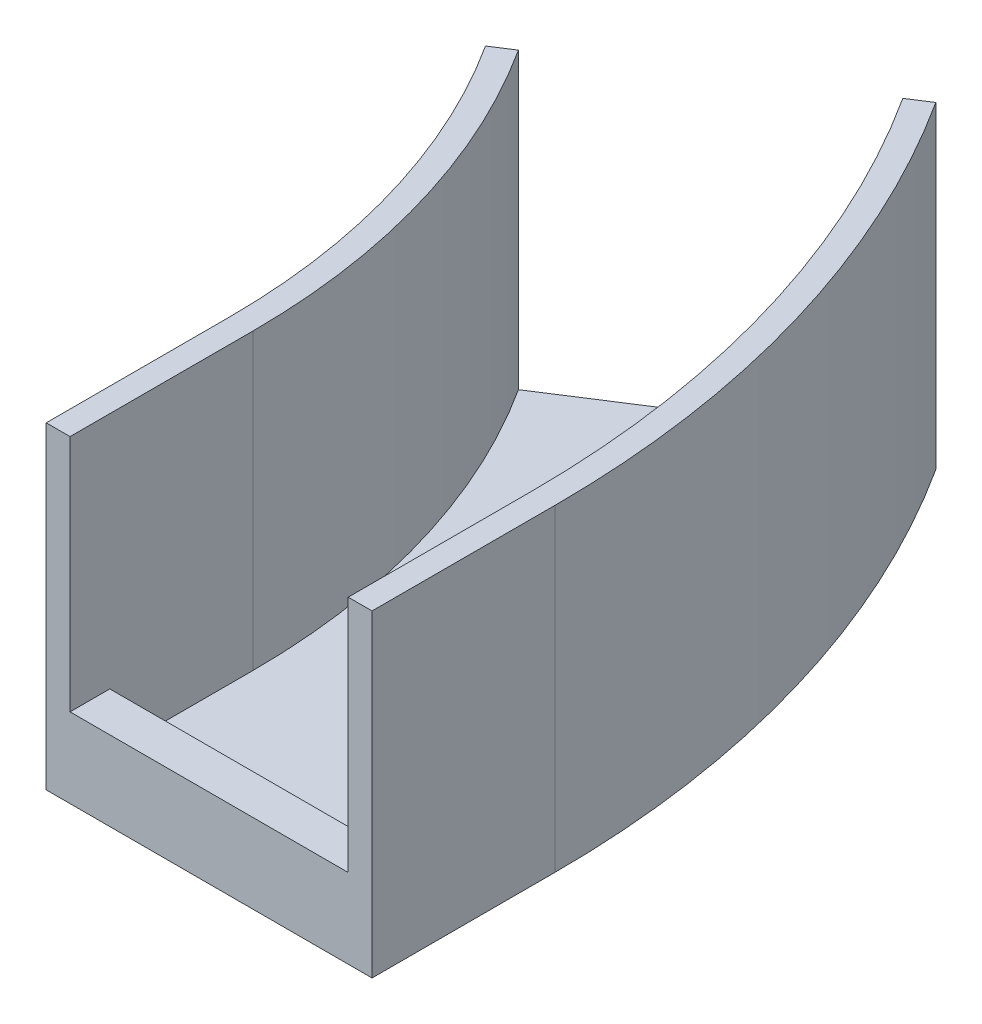
ISO-10303-21;
HEADER;
FILE_DESCRIPTION(('STEP AP214'),'2;1');
FILE_NAME('part.step','',(''),(''),'','','');
FILE_SCHEMA(('AUTOMOTIVE_DESIGN { 1 0 10303 214 1 1 1 1 }'));
ENDSEC;
DATA;
#1=APPLICATION_CONTEXT('core data for automotive mechanical design processes');
#2=APPLICATION_PROTOCOL_DEFINITION('international standard','automotive_design',2000,#1);
#3=PRODUCT_CONTEXT('',#1,'mechanical');
#4=PRODUCT('Part','Part','',(#3));
#5=PRODUCT_RELATED_PRODUCT_CATEGORY('part','',(#4));
#6=PRODUCT_DEFINITION_FORMATION('','',#4);
#7=PRODUCT_DEFINITION_CONTEXT('part definition',#1,'design');
#8=PRODUCT_DEFINITION('design','',#6,#7);
#9=PRODUCT_DEFINITION_SHAPE('','',#8);
#10=(LENGTH_UNIT() NAMED_UNIT(*) SI_UNIT(.MILLI.,.METRE.));
#11=(NAMED_UNIT(*) PLANE_ANGLE_UNIT() SI_UNIT($,.RADIAN.));
#12=(NAMED_UNIT(*) SI_UNIT($,.STERADIAN.) SOLID_ANGLE_UNIT());
#13=UNCERTAINTY_MEASURE_WITH_UNIT(LENGTH_MEASURE(1.E-05),#10,'distance_accuracy_value','');
#14=(GEOMETRIC_REPRESENTATION_CONTEXT(3) GLOBAL_UNCERTAINTY_ASSIGNED_CONTEXT((#13)) GLOBAL_UNIT_ASSIGNED_CONTEXT((#10,
#11,#12)) REPRESENTATION_CONTEXT('',''));
#15=CARTESIAN_POINT('',(0.,0.,0.));
#16=DIRECTION('',(0.,0.,1.));
#17=DIRECTION('',(1.,0.,0.));
#18=AXIS2_PLACEMENT_3D('',#15,#16,#17);
#19=CARTESIAN_POINT('',(0.,40.,0.));
#20=DIRECTION('',(0.,-1.,0.));
#21=DIRECTION('',(0.,0.,-1.));
#22=AXIS2_PLACEMENT_3D('',#19,#20,#21);
#23=CYLINDRICAL_SURFACE('',#22,87.5);
#24=CARTESIAN_POINT('',(0.,3.,0.));
#25=DIRECTION('',(0.,-1.,0.));
#26=DIRECTION('',(0.,0.,-1.));
#27=AXIS2_PLACEMENT_3D('',#24,#25,#26);
#28=CIRCLE('',#27,87.5);
#29=CARTESIAN_POINT('',(73.5991740759714,3.,-47.3224214863828));
#30=VERTEX_POINT('',#29);
#31=CARTESIAN_POINT('',(87.5,3.,0.));
#32=VERTEX_POINT('',#31);
#33=EDGE_CURVE('E56',#30,#32,#28,.T.);
#34=ORIENTED_EDGE('',*,*,#33,.F.);
#35=DIRECTION('',(0.,-1.,0.));
#36=VECTOR('',#35,1.);
#37=CARTESIAN_POINT('',(73.5991740759714,40.,-47.3224214863828));
#38=LINE('',#37,#36);
#39=CARTESIAN_POINT('',(73.5991740759714,40.,-47.3224214863828));
#40=VERTEX_POINT('',#39);
#41=EDGE_CURVE('E49',#40,#30,#38,.T.);
#42=ORIENTED_EDGE('',*,*,#41,.F.);
#43=CARTESIAN_POINT('',(0.,40.,0.));
#44=DIRECTION('',(0.,1.,0.));
#45=DIRECTION('',(0.,0.,1.));
#46=AXIS2_PLACEMENT_3D('',#43,#44,#45);
#47=CIRCLE('',#46,87.5);
#48=CARTESIAN_POINT('',(87.5,40.,0.));
#49=VERTEX_POINT('',#48);
#50=EDGE_CURVE('E157',#49,#40,#47,.T.);
#51=ORIENTED_EDGE('',*,*,#50,.F.);
#52=DIRECTION('',(0.,-1.,0.));
#53=VECTOR('',#52,1.);
#54=CARTESIAN_POINT('',(87.5,40.,0.));
#55=LINE('',#54,#53);
#56=EDGE_CURVE('E241',#49,#32,#55,.T.);
#57=ORIENTED_EDGE('',*,*,#56,.T.);
#58=EDGE_LOOP('',(#34,#42,#51,#57));
#59=FACE_BOUND('',#58,.T.);
#60=ADVANCED_FACE('F41',(#59),#23,.T.);
#61=CARTESIAN_POINT('',(87.5,40.,0.));
#62=DIRECTION('',(1.,0.,0.));
#63=DIRECTION('',(0.,0.,-1.));
#64=AXIS2_PLACEMENT_3D('',#61,#62,#63);
#65=PLANE('',#64);
#66=DIRECTION('',(0.,1.,0.));
#67=VECTOR('',#66,1.);
#68=CARTESIAN_POINT('',(87.5,40.,18.));
#69=LINE('',#68,#67);
#70=CARTESIAN_POINT('',(87.5,3.,18.));
#71=VERTEX_POINT('',#70);
#72=CARTESIAN_POINT('',(87.5,10.,18.));
#73=VERTEX_POINT('',#72);
#74=EDGE_CURVE('E217',#71,#73,#69,.T.);
#75=ORIENTED_EDGE('',*,*,#74,.F.);
#76=DIRECTION('',(0.,0.,1.));
#77=VECTOR('',#76,1.);
#78=CARTESIAN_POINT('',(87.5,3.,0.));
#79=LINE('',#78,#77);
#80=EDGE_CURVE('E64',#32,#71,#79,.T.);
#81=ORIENTED_EDGE('',*,*,#80,.F.);
#82=ORIENTED_EDGE('',*,*,#56,.F.);
#83=DIRECTION('',(0.,0.,1.));
#84=VECTOR('',#83,1.);
#85=CARTESIAN_POINT('',(87.5,40.,20.));
#86=LINE('',#85,#84);
#87=CARTESIAN_POINT('',(87.5,40.,23.));
#88=VERTEX_POINT('',#87);
#89=EDGE_CURVE('E237',#49,#88,#86,.T.);
#90=ORIENTED_EDGE('',*,*,#89,.T.);
#91=DIRECTION('',(0.,-1.,0.));
#92=VECTOR('',#91,1.);
#93=CARTESIAN_POINT('',(87.5,40.,23.));
#94=LINE('',#93,#92);
#95=CARTESIAN_POINT('',(87.5,10.,23.));
#96=VERTEX_POINT('',#95);
#97=EDGE_CURVE('E252',#88,#96,#94,.T.);
#98=ORIENTED_EDGE('',*,*,#97,.T.);
#99=DIRECTION('',(0.,0.,1.));
#100=VECTOR('',#99,1.);
#101=CARTESIAN_POINT('',(87.5,10.,0.));
#102=LINE('',#101,#100);
#103=EDGE_CURVE('E11',#73,#96,#102,.T.);
#104=ORIENTED_EDGE('',*,*,#103,.F.);
#105=EDGE_LOOP('',(#75,#81,#82,#90,#98,#104));
#106=FACE_BOUND('',#105,.T.);
#107=ADVANCED_FACE('F316',(#106),#65,.T.);
#108=CARTESIAN_POINT('',(87.4825495110081,10.,18.));
#109=DIRECTION('',(0.,0.,-1.));
#110=DIRECTION('',(-1.,0.,0.));
#111=AXIS2_PLACEMENT_3D('',#108,#109,#110);
#112=PLANE('',#111);
#113=DIRECTION('',(0.,-1.,0.));
#114=VECTOR('',#113,1.);
#115=CARTESIAN_POINT('',(122.5,10.,18.));
#116=LINE('',#115,#114);
#117=CARTESIAN_POINT('',(122.5,10.,18.));
#118=VERTEX_POINT('',#117);
#119=CARTESIAN_POINT('',(122.5,3.,18.));
#120=VERTEX_POINT('',#119);
#121=EDGE_CURVE('E213',#118,#120,#116,.T.);
#122=ORIENTED_EDGE('',*,*,#121,.T.);
#123=DIRECTION('',(1.,0.,0.));
#124=VECTOR('',#123,1.);
#125=CARTESIAN_POINT('',(0.,3.,18.));
#126=LINE('',#125,#124);
#127=EDGE_CURVE('E288',#71,#120,#126,.T.);
#128=ORIENTED_EDGE('',*,*,#127,.F.);
#129=ORIENTED_EDGE('',*,*,#74,.T.);
#130=DIRECTION('',(1.,0.,0.));
#131=VECTOR('',#130,1.);
#132=CARTESIAN_POINT('',(87.4825495110081,10.,18.));
#133=LINE('',#132,#131);
#134=EDGE_CURVE('E180',#73,#118,#133,.T.);
#135=ORIENTED_EDGE('',*,*,#134,.T.);
#136=EDGE_LOOP('',(#122,#128,#129,#135));
#137=FACE_BOUND('',#136,.T.);
#138=ADVANCED_FACE('F313',(#137),#112,.T.);
#139=CARTESIAN_POINT('',(0.,40.,0.));
#140=DIRECTION('',(0.,-1.,0.));
#141=DIRECTION('',(0.,0.,-1.));
#142=AXIS2_PLACEMENT_3D('',#139,#140,#141);
#143=CYLINDRICAL_SURFACE('',#142,122.5);
#144=DIRECTION('',(0.,-1.,0.));
#145=VECTOR('',#144,1.);
#146=CARTESIAN_POINT('',(103.03884370636,40.,-66.2513900809359));
#147=LINE('',#146,#145);
#148=CARTESIAN_POINT('',(103.03884370636,40.,-66.2513900809359));
#149=VERTEX_POINT('',#148);
#150=CARTESIAN_POINT('',(103.03884370636,3.,-66.2513900809359));
#151=VERTEX_POINT('',#150);
#152=EDGE_CURVE('E193',#149,#151,#147,.T.);
#153=ORIENTED_EDGE('',*,*,#152,.T.);
#154=CARTESIAN_POINT('',(0.,3.,0.));
#155=DIRECTION('',(0.,-1.,0.));
#156=DIRECTION('',(0.,0.,-1.));
#157=AXIS2_PLACEMENT_3D('',#154,#155,#156);
#158=CIRCLE('',#157,122.5);
#159=CARTESIAN_POINT('',(122.5,3.,0.));
#160=VERTEX_POINT('',#159);
#161=EDGE_CURVE('E277',#160,#151,#158,.F.);
#162=ORIENTED_EDGE('',*,*,#161,.F.);
#163=DIRECTION('',(0.,-1.,0.));
#164=VECTOR('',#163,1.);
#165=CARTESIAN_POINT('',(122.5,40.,0.));
#166=LINE('',#165,#164);
#167=CARTESIAN_POINT('',(122.5,40.,0.));
#168=VERTEX_POINT('',#167);
#169=EDGE_CURVE('E186',#168,#160,#166,.T.);
#170=ORIENTED_EDGE('',*,*,#169,.F.);
#171=CARTESIAN_POINT('',(0.,40.,0.));
#172=DIRECTION('',(0.,1.,0.));
#173=DIRECTION('',(0.,0.,1.));
#174=AXIS2_PLACEMENT_3D('',#171,#172,#173);
#175=CIRCLE('',#174,122.5);
#176=EDGE_CURVE('E176',#168,#149,#175,.T.);
#177=ORIENTED_EDGE('',*,*,#176,.T.);
#178=EDGE_LOOP('',(#153,#162,#170,#177));
#179=FACE_BOUND('',#178,.T.);
#180=ADVANCED_FACE('F337',(#179),#143,.F.);
#181=CARTESIAN_POINT('',(122.5,40.,0.));
#182=DIRECTION('',(1.,0.,0.));
#183=DIRECTION('',(0.,0.,-1.));
#184=AXIS2_PLACEMENT_3D('',#181,#182,#183);
#185=PLANE('',#184);
#186=DIRECTION('',(0.,0.,-1.));
#187=VECTOR('',#186,1.);
#188=CARTESIAN_POINT('',(122.5,3.,0.));
#189=LINE('',#188,#187);
#190=EDGE_CURVE('E282',#120,#160,#189,.T.);
#191=ORIENTED_EDGE('',*,*,#190,.F.);
#192=ORIENTED_EDGE('',*,*,#121,.F.);
#193=DIRECTION('',(0.,0.,1.));
#194=VECTOR('',#193,1.);
#195=CARTESIAN_POINT('',(122.5,10.,23.));
#196=LINE('',#195,#194);
#197=CARTESIAN_POINT('',(122.5,10.,23.));
#198=VERTEX_POINT('',#197);
#199=EDGE_CURVE('E205',#118,#198,#196,.T.);
#200=ORIENTED_EDGE('',*,*,#199,.T.);
#201=DIRECTION('',(0.,-1.,0.));
#202=VECTOR('',#201,1.);
#203=CARTESIAN_POINT('',(122.5,40.,23.));
#204=LINE('',#203,#202);
#205=CARTESIAN_POINT('',(122.5,40.,23.));
#206=VERTEX_POINT('',#205);
#207=EDGE_CURVE('E169',#206,#198,#204,.T.);
#208=ORIENTED_EDGE('',*,*,#207,.F.);
#209=DIRECTION('',(0.,0.,1.));
#210=VECTOR('',#209,1.);
#211=CARTESIAN_POINT('',(122.5,40.,20.));
#212=LINE('',#211,#210);
#213=EDGE_CURVE('E189',#168,#206,#212,.T.);
#214=ORIENTED_EDGE('',*,*,#213,.F.);
#215=ORIENTED_EDGE('',*,*,#169,.T.);
#216=EDGE_LOOP('',(#191,#192,#200,#208,#214,#215));
#217=FACE_BOUND('',#216,.T.);
#218=ADVANCED_FACE('F308',(#217),#185,.F.);
#219=CARTESIAN_POINT('',(71.0757738219381,40.,-45.6999384639925));
#220=DIRECTION('',(-0.540827674130088,0.,-0.841133418011102));
#221=DIRECTION('',(-0.841133418011102,0.,0.540827674130088));
#222=AXIS2_PLACEMENT_3D('',#219,#220,#221);
#223=PLANE('',#222);
#224=DIRECTION('',(0.841133418011102,0.,-0.540827674130088));
#225=VECTOR('',#224,1.);
#226=CARTESIAN_POINT('',(71.0757738219381,0.,-45.6999384639925));
#227=LINE('',#226,#225);
#228=CARTESIAN_POINT('',(71.0757738219381,0.,-45.6999384639925));
#229=VERTEX_POINT('',#228);
#230=CARTESIAN_POINT('',(105.562243960393,0.,-67.8738731033262));
#231=VERTEX_POINT('',#230);
#232=EDGE_CURVE('E220',#229,#231,#227,.T.);
#233=ORIENTED_EDGE('',*,*,#232,.F.);
#234=DIRECTION('',(0.,-1.,0.));
#235=VECTOR('',#234,1.);
#236=CARTESIAN_POINT('',(71.0757738219381,40.,-45.6999384639925));
#237=LINE('',#236,#235);
#238=CARTESIAN_POINT('',(71.0757738219381,40.,-45.6999384639925));
#239=VERTEX_POINT('',#238);
#240=EDGE_CURVE('E261',#239,#229,#237,.T.);
#241=ORIENTED_EDGE('',*,*,#240,.F.);
#242=DIRECTION('',(0.841133418011102,0.,-0.540827674130088));
#243=VECTOR('',#242,1.);
#244=CARTESIAN_POINT('',(71.0757738219381,40.,-45.6999384639925));
#245=LINE('',#244,#243);
#246=EDGE_CURVE('E223',#239,#40,#245,.T.);
#247=ORIENTED_EDGE('',*,*,#246,.T.);
#248=ORIENTED_EDGE('',*,*,#41,.T.);
#249=DIRECTION('',(0.841133418011102,0.,-0.540827674130089));
#250=VECTOR('',#249,1.);
#251=CARTESIAN_POINT('',(0.,3.,0.));
#252=LINE('',#251,#250);
#253=EDGE_CURVE('E270',#30,#151,#252,.T.);
#254=ORIENTED_EDGE('',*,*,#253,.T.);
#255=ORIENTED_EDGE('',*,*,#152,.F.);
#256=DIRECTION('',(-0.841133418011102,0.,0.540827674130088));
#257=VECTOR('',#256,1.);
#258=CARTESIAN_POINT('',(105.562243960393,40.,-67.8738731033262));
#259=LINE('',#258,#257);
#260=CARTESIAN_POINT('',(105.562243960393,40.,-67.8738731033262));
#261=VERTEX_POINT('',#260);
#262=EDGE_CURVE('E183',#261,#149,#259,.T.);
#263=ORIENTED_EDGE('',*,*,#262,.F.);
#264=DIRECTION('',(0.,-1.,0.));
#265=VECTOR('',#264,1.);
#266=CARTESIAN_POINT('',(105.562243960393,40.,-67.8738731033262));
#267=LINE('',#266,#265);
#268=EDGE_CURVE('E296',#261,#231,#267,.T.);
#269=ORIENTED_EDGE('',*,*,#268,.T.);
#270=EDGE_LOOP('',(#233,#241,#247,#248,#254,#255,#263,#269));
#271=FACE_BOUND('',#270,.T.);
#272=ADVANCED_FACE('F268',(#271),#223,.T.);
#273=CARTESIAN_POINT('',(0.,40.,0.));
#274=DIRECTION('',(0.,-1.,0.));
#275=DIRECTION('',(0.,0.,-1.));
#276=AXIS2_PLACEMENT_3D('',#273,#274,#275);
#277=CYLINDRICAL_SURFACE('',#276,84.5);
#278=CARTESIAN_POINT('',(0.,0.,0.));
#279=DIRECTION('',(0.,1.,0.));
#280=DIRECTION('',(0.,0.,1.));
#281=AXIS2_PLACEMENT_3D('',#278,#279,#280);
#282=CIRCLE('',#281,84.5);
#283=CARTESIAN_POINT('',(84.5,0.,0.));
#284=VERTEX_POINT('',#283);
#285=EDGE_CURVE('E244',#284,#229,#282,.T.);
#286=ORIENTED_EDGE('',*,*,#285,.F.);
#287=DIRECTION('',(0.,-1.,0.));
#288=VECTOR('',#287,1.);
#289=CARTESIAN_POINT('',(84.5,40.,0.));
#290=LINE('',#289,#288);
#291=CARTESIAN_POINT('',(84.5,40.,0.));
#292=VERTEX_POINT('',#291);
#293=EDGE_CURVE('E258',#292,#284,#290,.T.);
#294=ORIENTED_EDGE('',*,*,#293,.F.);
#295=CARTESIAN_POINT('',(0.,40.,0.));
#296=DIRECTION('',(0.,1.,0.));
#297=DIRECTION('',(0.,0.,1.));
#298=AXIS2_PLACEMENT_3D('',#295,#296,#297);
#299=CIRCLE('',#298,84.5);
#300=EDGE_CURVE('E227',#292,#239,#299,.T.);
#301=ORIENTED_EDGE('',*,*,#300,.T.);
#302=ORIENTED_EDGE('',*,*,#240,.T.);
#303=EDGE_LOOP('',(#286,#294,#301,#302));
#304=FACE_BOUND('',#303,.T.);
#305=ADVANCED_FACE('F327',(#304),#277,.F.);
#306=CARTESIAN_POINT('',(84.5,40.,0.));
#307=DIRECTION('',(1.,0.,0.));
#308=DIRECTION('',(0.,0.,-1.));
#309=AXIS2_PLACEMENT_3D('',#306,#307,#308);
#310=PLANE('',#309);
#311=DIRECTION('',(0.,0.,1.));
#312=VECTOR('',#311,1.);
#313=CARTESIAN_POINT('',(84.5,0.,0.));
#314=LINE('',#313,#312);
#315=CARTESIAN_POINT('',(84.5,0.,23.));
#316=VERTEX_POINT('',#315);
#317=EDGE_CURVE('E158',#284,#316,#314,.T.);
#318=ORIENTED_EDGE('',*,*,#317,.T.);
#319=DIRECTION('',(0.,-1.,0.));
#320=VECTOR('',#319,1.);
#321=CARTESIAN_POINT('',(84.5,40.,23.));
#322=LINE('',#321,#320);
#323=CARTESIAN_POINT('',(84.5,40.,23.));
#324=VERTEX_POINT('',#323);
#325=EDGE_CURVE('E151',#324,#316,#322,.T.);
#326=ORIENTED_EDGE('',*,*,#325,.F.);
#327=DIRECTION('',(0.,0.,1.));
#328=VECTOR('',#327,1.);
#329=CARTESIAN_POINT('',(84.5,40.,0.));
#330=LINE('',#329,#328);
#331=EDGE_CURVE('E231',#292,#324,#330,.T.);
#332=ORIENTED_EDGE('',*,*,#331,.F.);
#333=ORIENTED_EDGE('',*,*,#293,.T.);
#334=EDGE_LOOP('',(#318,#326,#332,#333));
#335=FACE_BOUND('',#334,.T.);
#336=ADVANCED_FACE('F329',(#335),#310,.F.);
#337=CARTESIAN_POINT('',(87.5,40.,23.));
#338=DIRECTION('',(0.,0.,1.));
#339=DIRECTION('',(1.,0.,0.));
#340=AXIS2_PLACEMENT_3D('',#337,#338,#339);
#341=PLANE('',#340);
#342=DIRECTION('',(-1.,0.,0.));
#343=VECTOR('',#342,1.);
#344=CARTESIAN_POINT('',(87.5,0.,23.));
#345=LINE('',#344,#343);
#346=CARTESIAN_POINT('',(125.5,0.,23.));
#347=VERTEX_POINT('',#346);
#348=EDGE_CURVE('E143',#347,#316,#345,.T.);
#349=ORIENTED_EDGE('',*,*,#348,.F.);
#350=DIRECTION('',(0.,-1.,0.));
#351=VECTOR('',#350,1.);
#352=CARTESIAN_POINT('',(125.5,40.,23.));
#353=LINE('',#352,#351);
#354=CARTESIAN_POINT('',(125.5,40.,23.));
#355=VERTEX_POINT('',#354);
#356=EDGE_CURVE('E147',#355,#347,#353,.T.);
#357=ORIENTED_EDGE('',*,*,#356,.F.);
#358=DIRECTION('',(-1.,0.,0.));
#359=VECTOR('',#358,1.);
#360=CARTESIAN_POINT('',(125.5,40.,23.));
#361=LINE('',#360,#359);
#362=EDGE_CURVE('E192',#355,#206,#361,.T.);
#363=ORIENTED_EDGE('',*,*,#362,.T.);
#364=ORIENTED_EDGE('',*,*,#207,.T.);
#365=DIRECTION('',(-1.,0.,0.));
#366=VECTOR('',#365,1.);
#367=CARTESIAN_POINT('',(87.5,10.,23.));
#368=LINE('',#367,#366);
#369=EDGE_CURVE('E209',#198,#96,#368,.T.);
#370=ORIENTED_EDGE('',*,*,#369,.T.);
#371=ORIENTED_EDGE('',*,*,#97,.F.);
#372=DIRECTION('',(-1.,0.,0.));
#373=VECTOR('',#372,1.);
#374=CARTESIAN_POINT('',(87.5,40.,23.));
#375=LINE('',#374,#373);
#376=EDGE_CURVE('E234',#88,#324,#375,.T.);
#377=ORIENTED_EDGE('',*,*,#376,.T.);
#378=ORIENTED_EDGE('',*,*,#325,.T.);
#379=EDGE_LOOP('',(#349,#357,#363,#364,#370,#371,#377,#378));
#380=FACE_BOUND('',#379,.T.);
#381=ADVANCED_FACE('F145',(#380),#341,.T.);
#382=CARTESIAN_POINT('',(0.,40.,0.));
#383=DIRECTION('',(0.,1.,0.));
#384=DIRECTION('',(0.,0.,1.));
#385=AXIS2_PLACEMENT_3D('',#382,#383,#384);
#386=PLANE('',#385);
#387=ORIENTED_EDGE('',*,*,#50,.T.);
#388=ORIENTED_EDGE('',*,*,#246,.F.);
#389=ORIENTED_EDGE('',*,*,#300,.F.);
#390=ORIENTED_EDGE('',*,*,#331,.T.);
#391=ORIENTED_EDGE('',*,*,#376,.F.);
#392=ORIENTED_EDGE('',*,*,#89,.F.);
#393=EDGE_LOOP('',(#387,#388,#389,#390,#391,#392));
#394=FACE_BOUND('',#393,.T.);
#395=ADVANCED_FACE('F322',(#394),#386,.T.);
#396=CARTESIAN_POINT('',(0.,0.,0.));
#397=DIRECTION('',(0.,1.,0.));
#398=DIRECTION('',(0.,0.,1.));
#399=AXIS2_PLACEMENT_3D('',#396,#397,#398);
#400=PLANE('',#399);
#401=ORIENTED_EDGE('',*,*,#232,.T.);
#402=CARTESIAN_POINT('',(0.,0.,0.));
#403=DIRECTION('',(0.,1.,0.));
#404=DIRECTION('',(0.,0.,1.));
#405=AXIS2_PLACEMENT_3D('',#402,#403,#404);
#406=CIRCLE('',#405,125.5);
#407=CARTESIAN_POINT('',(125.5,0.,0.));
#408=VERTEX_POINT('',#407);
#409=EDGE_CURVE('E174',#408,#231,#406,.T.);
#410=ORIENTED_EDGE('',*,*,#409,.F.);
#411=DIRECTION('',(0.,0.,1.));
#412=VECTOR('',#411,1.);
#413=CARTESIAN_POINT('',(125.5,0.,0.));
#414=LINE('',#413,#412);
#415=EDGE_CURVE('E164',#408,#347,#414,.T.);
#416=ORIENTED_EDGE('',*,*,#415,.T.);
#417=ORIENTED_EDGE('',*,*,#348,.T.);
#418=ORIENTED_EDGE('',*,*,#317,.F.);
#419=ORIENTED_EDGE('',*,*,#285,.T.);
#420=EDGE_LOOP('',(#401,#410,#416,#417,#418,#419));
#421=FACE_BOUND('',#420,.T.);
#422=ADVANCED_FACE('F172',(#421),#400,.F.);
#423=CARTESIAN_POINT('',(0.,10.,0.));
#424=DIRECTION('',(0.,1.,0.));
#425=DIRECTION('',(0.,0.,1.));
#426=AXIS2_PLACEMENT_3D('',#423,#424,#425);
#427=PLANE('',#426);
#428=ORIENTED_EDGE('',*,*,#134,.F.);
#429=ORIENTED_EDGE('',*,*,#103,.T.);
#430=ORIENTED_EDGE('',*,*,#369,.F.);
#431=ORIENTED_EDGE('',*,*,#199,.F.);
#432=EDGE_LOOP('',(#428,#429,#430,#431));
#433=FACE_BOUND('',#432,.T.);
#434=ADVANCED_FACE('F318',(#433),#427,.T.);
#435=CARTESIAN_POINT('',(125.5,40.,0.));
#436=DIRECTION('',(1.,0.,0.));
#437=DIRECTION('',(0.,0.,-1.));
#438=AXIS2_PLACEMENT_3D('',#435,#436,#437);
#439=PLANE('',#438);
#440=ORIENTED_EDGE('',*,*,#415,.F.);
#441=DIRECTION('',(0.,-1.,0.));
#442=VECTOR('',#441,1.);
#443=CARTESIAN_POINT('',(125.5,40.,0.));
#444=LINE('',#443,#442);
#445=CARTESIAN_POINT('',(125.5,40.,0.));
#446=VERTEX_POINT('',#445);
#447=EDGE_CURVE('E168',#446,#408,#444,.T.);
#448=ORIENTED_EDGE('',*,*,#447,.F.);
#449=DIRECTION('',(0.,0.,1.));
#450=VECTOR('',#449,1.);
#451=CARTESIAN_POINT('',(125.5,40.,0.));
#452=LINE('',#451,#450);
#453=EDGE_CURVE('E166',#446,#355,#452,.T.);
#454=ORIENTED_EDGE('',*,*,#453,.T.);
#455=ORIENTED_EDGE('',*,*,#356,.T.);
#456=EDGE_LOOP('',(#440,#448,#454,#455));
#457=FACE_BOUND('',#456,.T.);
#458=ADVANCED_FACE('F163',(#457),#439,.T.);
#459=CARTESIAN_POINT('',(0.,40.,0.));
#460=DIRECTION('',(0.,-1.,0.));
#461=DIRECTION('',(0.,0.,-1.));
#462=AXIS2_PLACEMENT_3D('',#459,#460,#461);
#463=CYLINDRICAL_SURFACE('',#462,125.5);
#464=ORIENTED_EDGE('',*,*,#409,.T.);
#465=ORIENTED_EDGE('',*,*,#268,.F.);
#466=CARTESIAN_POINT('',(0.,40.,0.));
#467=DIRECTION('',(0.,1.,0.));
#468=DIRECTION('',(0.,0.,1.));
#469=AXIS2_PLACEMENT_3D('',#466,#467,#468);
#470=CIRCLE('',#469,125.5);
#471=EDGE_CURVE('E198',#446,#261,#470,.T.);
#472=ORIENTED_EDGE('',*,*,#471,.F.);
#473=ORIENTED_EDGE('',*,*,#447,.T.);
#474=EDGE_LOOP('',(#464,#465,#472,#473));
#475=FACE_BOUND('',#474,.T.);
#476=ADVANCED_FACE('F332',(#475),#463,.T.);
#477=CARTESIAN_POINT('',(0.,40.,0.));
#478=DIRECTION('',(0.,1.,0.));
#479=DIRECTION('',(0.,0.,1.));
#480=AXIS2_PLACEMENT_3D('',#477,#478,#479);
#481=PLANE('',#480);
#482=ORIENTED_EDGE('',*,*,#176,.F.);
#483=ORIENTED_EDGE('',*,*,#213,.T.);
#484=ORIENTED_EDGE('',*,*,#362,.F.);
#485=ORIENTED_EDGE('',*,*,#453,.F.);
#486=ORIENTED_EDGE('',*,*,#471,.T.);
#487=ORIENTED_EDGE('',*,*,#262,.T.);
#488=EDGE_LOOP('',(#482,#483,#484,#485,#486,#487));
#489=FACE_BOUND('',#488,.T.);
#490=ADVANCED_FACE('F336',(#489),#481,.T.);
#491=CARTESIAN_POINT('',(0.,3.,0.));
#492=DIRECTION('',(0.,-1.,0.));
#493=DIRECTION('',(0.,0.,-1.));
#494=AXIS2_PLACEMENT_3D('',#491,#492,#493);
#495=PLANE('',#494);
#496=ORIENTED_EDGE('',*,*,#33,.T.);
#497=ORIENTED_EDGE('',*,*,#80,.T.);
#498=ORIENTED_EDGE('',*,*,#127,.T.);
#499=ORIENTED_EDGE('',*,*,#190,.T.);
#500=ORIENTED_EDGE('',*,*,#161,.T.);
#501=ORIENTED_EDGE('',*,*,#253,.F.);
#502=EDGE_LOOP('',(#496,#497,#498,#499,#500,#501));
#503=FACE_BOUND('',#502,.T.);
#504=ADVANCED_FACE('F275',(#503),#495,.F.);
#505=CLOSED_SHELL('',(#60,#107,#138,#180,#218,#272,#305,#336,#381,#395,#422,#434,#458,#476,#490,#504));
#506=MANIFOLD_SOLID_BREP('B2',#505);
#507=ADVANCED_BREP_SHAPE_REPRESENTATION('',(#18,#506),#14);
#508=SHAPE_DEFINITION_REPRESENTATION(#9,#507);
ENDSEC;
END-ISO-10303-21;
